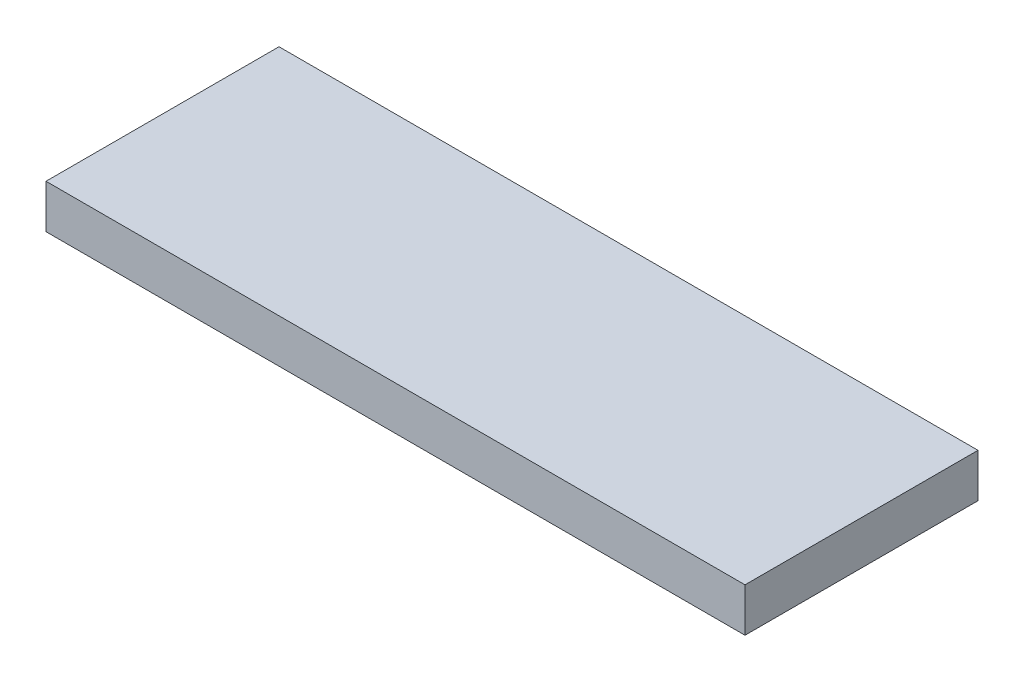
ISO-10303-21;
HEADER;
FILE_DESCRIPTION(('STEP AP214'),'2;1');
FILE_NAME('part.step','',(''),(''),'','','');
FILE_SCHEMA(('AUTOMOTIVE_DESIGN { 1 0 10303 214 1 1 1 1 }'));
ENDSEC;
DATA;
#1=APPLICATION_CONTEXT('core data for automotive mechanical design processes');
#2=APPLICATION_PROTOCOL_DEFINITION('international standard','automotive_design',2000,#1);
#3=PRODUCT_CONTEXT('',#1,'mechanical');
#4=PRODUCT('Part','Part','',(#3));
#5=PRODUCT_RELATED_PRODUCT_CATEGORY('part','',(#4));
#6=PRODUCT_DEFINITION_FORMATION('','',#4);
#7=PRODUCT_DEFINITION_CONTEXT('part definition',#1,'design');
#8=PRODUCT_DEFINITION('design','',#6,#7);
#9=PRODUCT_DEFINITION_SHAPE('','',#8);
#10=(LENGTH_UNIT() NAMED_UNIT(*) SI_UNIT(.MILLI.,.METRE.));
#11=(NAMED_UNIT(*) PLANE_ANGLE_UNIT() SI_UNIT($,.RADIAN.));
#12=(NAMED_UNIT(*) SI_UNIT($,.STERADIAN.) SOLID_ANGLE_UNIT());
#13=UNCERTAINTY_MEASURE_WITH_UNIT(LENGTH_MEASURE(1.E-05),#10,'distance_accuracy_value','');
#14=(GEOMETRIC_REPRESENTATION_CONTEXT(3) GLOBAL_UNCERTAINTY_ASSIGNED_CONTEXT((#13)) GLOBAL_UNIT_ASSIGNED_CONTEXT((#10,
#11,#12)) REPRESENTATION_CONTEXT('',''));
#15=CARTESIAN_POINT('',(0.,0.,0.));
#16=DIRECTION('',(0.,0.,1.));
#17=DIRECTION('',(1.,0.,0.));
#18=AXIS2_PLACEMENT_3D('',#15,#16,#17);
#19=CARTESIAN_POINT('',(0.,4.7625,-25.4));
#20=DIRECTION('',(1.,0.,0.));
#21=DIRECTION('',(0.,0.,-1.));
#22=AXIS2_PLACEMENT_3D('',#19,#20,#21);
#23=PLANE('',#22);
#24=DIRECTION('',(0.,0.,1.));
#25=VECTOR('',#24,1.);
#26=CARTESIAN_POINT('',(0.,0.,-25.4));
#27=LINE('',#26,#25);
#28=CARTESIAN_POINT('',(0.,0.,-25.4));
#29=VERTEX_POINT('',#28);
#30=CARTESIAN_POINT('',(0.,0.,0.));
#31=VERTEX_POINT('',#30);
#32=EDGE_CURVE('E96',#29,#31,#27,.T.);
#33=ORIENTED_EDGE('',*,*,#32,.T.);
#34=DIRECTION('',(0.,-1.,0.));
#35=VECTOR('',#34,1.);
#36=CARTESIAN_POINT('',(0.,4.7625,0.));
#37=LINE('',#36,#35);
#38=CARTESIAN_POINT('',(0.,4.7625,0.));
#39=VERTEX_POINT('',#38);
#40=EDGE_CURVE('E11',#39,#31,#37,.T.);
#41=ORIENTED_EDGE('',*,*,#40,.F.);
#42=DIRECTION('',(0.,0.,1.));
#43=VECTOR('',#42,1.);
#44=CARTESIAN_POINT('',(0.,4.7625,-25.4));
#45=LINE('',#44,#43);
#46=CARTESIAN_POINT('',(0.,4.7625,-25.4));
#47=VERTEX_POINT('',#46);
#48=EDGE_CURVE('E84',#47,#39,#45,.T.);
#49=ORIENTED_EDGE('',*,*,#48,.F.);
#50=DIRECTION('',(0.,-1.,0.));
#51=VECTOR('',#50,1.);
#52=CARTESIAN_POINT('',(0.,4.7625,-25.4));
#53=LINE('',#52,#51);
#54=EDGE_CURVE('E92',#47,#29,#53,.T.);
#55=ORIENTED_EDGE('',*,*,#54,.T.);
#56=EDGE_LOOP('',(#33,#41,#49,#55));
#57=FACE_BOUND('',#56,.T.);
#58=ADVANCED_FACE('F33',(#57),#23,.F.);
#59=CARTESIAN_POINT('',(0.,4.7625,0.));
#60=DIRECTION('',(0.,0.,-1.));
#61=DIRECTION('',(-1.,0.,0.));
#62=AXIS2_PLACEMENT_3D('',#59,#60,#61);
#63=PLANE('',#62);
#64=DIRECTION('',(1.,0.,0.));
#65=VECTOR('',#64,1.);
#66=CARTESIAN_POINT('',(0.,0.,0.));
#67=LINE('',#66,#65);
#68=CARTESIAN_POINT('',(76.2,0.,0.));
#69=VERTEX_POINT('',#68);
#70=EDGE_CURVE('E88',#31,#69,#67,.T.);
#71=ORIENTED_EDGE('',*,*,#70,.T.);
#72=DIRECTION('',(0.,-1.,0.));
#73=VECTOR('',#72,1.);
#74=CARTESIAN_POINT('',(76.2,4.7625,0.));
#75=LINE('',#74,#73);
#76=CARTESIAN_POINT('',(76.2,4.7625,0.));
#77=VERTEX_POINT('',#76);
#78=EDGE_CURVE('E41',#77,#69,#75,.T.);
#79=ORIENTED_EDGE('',*,*,#78,.F.);
#80=DIRECTION('',(1.,0.,0.));
#81=VECTOR('',#80,1.);
#82=CARTESIAN_POINT('',(0.,4.7625,0.));
#83=LINE('',#82,#81);
#84=EDGE_CURVE('E79',#39,#77,#83,.T.);
#85=ORIENTED_EDGE('',*,*,#84,.F.);
#86=ORIENTED_EDGE('',*,*,#40,.T.);
#87=EDGE_LOOP('',(#71,#79,#85,#86));
#88=FACE_BOUND('',#87,.T.);
#89=ADVANCED_FACE('F87',(#88),#63,.F.);
#90=CARTESIAN_POINT('',(76.2,4.7625,0.));
#91=DIRECTION('',(-1.,0.,0.));
#92=DIRECTION('',(0.,0.,1.));
#93=AXIS2_PLACEMENT_3D('',#90,#91,#92);
#94=PLANE('',#93);
#95=DIRECTION('',(0.,0.,-1.));
#96=VECTOR('',#95,1.);
#97=CARTESIAN_POINT('',(76.2,0.,0.));
#98=LINE('',#97,#96);
#99=CARTESIAN_POINT('',(76.2,0.,-25.4));
#100=VERTEX_POINT('',#99);
#101=EDGE_CURVE('E66',#69,#100,#98,.T.);
#102=ORIENTED_EDGE('',*,*,#101,.T.);
#103=DIRECTION('',(0.,-1.,0.));
#104=VECTOR('',#103,1.);
#105=CARTESIAN_POINT('',(76.2,4.7625,-25.4));
#106=LINE('',#105,#104);
#107=CARTESIAN_POINT('',(76.2,4.7625,-25.4));
#108=VERTEX_POINT('',#107);
#109=EDGE_CURVE('E89',#108,#100,#106,.T.);
#110=ORIENTED_EDGE('',*,*,#109,.F.);
#111=DIRECTION('',(0.,0.,-1.));
#112=VECTOR('',#111,1.);
#113=CARTESIAN_POINT('',(76.2,4.7625,0.));
#114=LINE('',#113,#112);
#115=EDGE_CURVE('E82',#77,#108,#114,.T.);
#116=ORIENTED_EDGE('',*,*,#115,.F.);
#117=ORIENTED_EDGE('',*,*,#78,.T.);
#118=EDGE_LOOP('',(#102,#110,#116,#117));
#119=FACE_BOUND('',#118,.T.);
#120=ADVANCED_FACE('F90',(#119),#94,.F.);
#121=CARTESIAN_POINT('',(76.2,4.7625,-25.4));
#122=DIRECTION('',(0.,0.,1.));
#123=DIRECTION('',(1.,0.,0.));
#124=AXIS2_PLACEMENT_3D('',#121,#122,#123);
#125=PLANE('',#124);
#126=DIRECTION('',(-1.,0.,0.));
#127=VECTOR('',#126,1.);
#128=CARTESIAN_POINT('',(76.2,0.,-25.4));
#129=LINE('',#128,#127);
#130=EDGE_CURVE('E72',#100,#29,#129,.T.);
#131=ORIENTED_EDGE('',*,*,#130,.T.);
#132=ORIENTED_EDGE('',*,*,#54,.F.);
#133=DIRECTION('',(-1.,0.,0.));
#134=VECTOR('',#133,1.);
#135=CARTESIAN_POINT('',(76.2,4.7625,-25.4));
#136=LINE('',#135,#134);
#137=EDGE_CURVE('E49',#108,#47,#136,.T.);
#138=ORIENTED_EDGE('',*,*,#137,.F.);
#139=ORIENTED_EDGE('',*,*,#109,.T.);
#140=EDGE_LOOP('',(#131,#132,#138,#139));
#141=FACE_BOUND('',#140,.T.);
#142=ADVANCED_FACE('F103',(#141),#125,.F.);
#143=CARTESIAN_POINT('',(0.,4.7625,0.));
#144=DIRECTION('',(0.,1.,0.));
#145=DIRECTION('',(0.,0.,1.));
#146=AXIS2_PLACEMENT_3D('',#143,#144,#145);
#147=PLANE('',#146);
#148=ORIENTED_EDGE('',*,*,#48,.T.);
#149=ORIENTED_EDGE('',*,*,#84,.T.);
#150=ORIENTED_EDGE('',*,*,#115,.T.);
#151=ORIENTED_EDGE('',*,*,#137,.T.);
#152=EDGE_LOOP('',(#148,#149,#150,#151));
#153=FACE_BOUND('',#152,.T.);
#154=ADVANCED_FACE('F80',(#153),#147,.T.);
#155=CARTESIAN_POINT('',(0.,0.,0.));
#156=DIRECTION('',(0.,1.,0.));
#157=DIRECTION('',(0.,0.,1.));
#158=AXIS2_PLACEMENT_3D('',#155,#156,#157);
#159=PLANE('',#158);
#160=ORIENTED_EDGE('',*,*,#32,.F.);
#161=ORIENTED_EDGE('',*,*,#130,.F.);
#162=ORIENTED_EDGE('',*,*,#101,.F.);
#163=ORIENTED_EDGE('',*,*,#70,.F.);
#164=EDGE_LOOP('',(#160,#161,#162,#163));
#165=FACE_BOUND('',#164,.T.);
#166=ADVANCED_FACE('F106',(#165),#159,.F.);
#167=CLOSED_SHELL('',(#58,#89,#120,#142,#154,#166));
#168=MANIFOLD_SOLID_BREP('B2',#167);
#169=ADVANCED_BREP_SHAPE_REPRESENTATION('',(#18,#168),#14);
#170=SHAPE_DEFINITION_REPRESENTATION(#9,#169);
ENDSEC;
END-ISO-10303-21;
